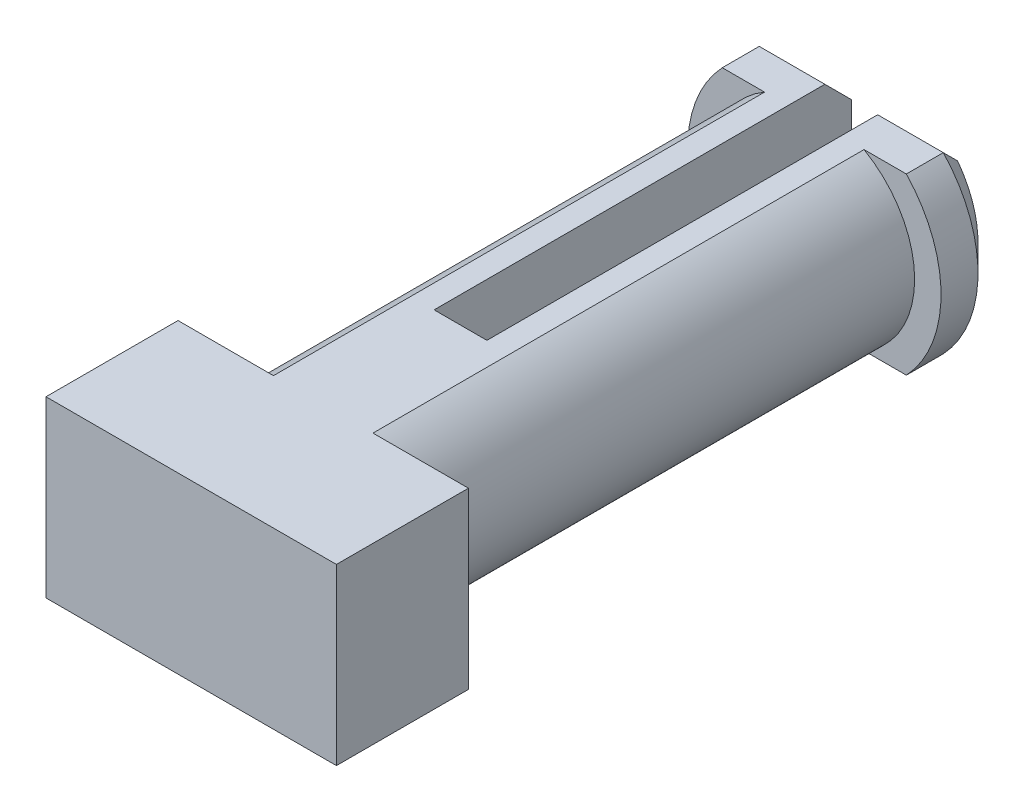
ISO-10303-21;
HEADER;
FILE_DESCRIPTION(('STEP AP214'),'2;1');
FILE_NAME('part.step','',(''),(''),'','','');
FILE_SCHEMA(('AUTOMOTIVE_DESIGN { 1 0 10303 214 1 1 1 1 }'));
ENDSEC;
DATA;
#1=APPLICATION_CONTEXT('core data for automotive mechanical design processes');
#2=APPLICATION_PROTOCOL_DEFINITION('international standard','automotive_design',2000,#1);
#3=PRODUCT_CONTEXT('',#1,'mechanical');
#4=PRODUCT('Part','Part','',(#3));
#5=PRODUCT_RELATED_PRODUCT_CATEGORY('part','',(#4));
#6=PRODUCT_DEFINITION_FORMATION('','',#4);
#7=PRODUCT_DEFINITION_CONTEXT('part definition',#1,'design');
#8=PRODUCT_DEFINITION('design','',#6,#7);
#9=PRODUCT_DEFINITION_SHAPE('','',#8);
#10=(LENGTH_UNIT() NAMED_UNIT(*) SI_UNIT(.MILLI.,.METRE.));
#11=(NAMED_UNIT(*) PLANE_ANGLE_UNIT() SI_UNIT($,.RADIAN.));
#12=(NAMED_UNIT(*) SI_UNIT($,.STERADIAN.) SOLID_ANGLE_UNIT());
#13=UNCERTAINTY_MEASURE_WITH_UNIT(LENGTH_MEASURE(1.E-05),#10,'distance_accuracy_value','');
#14=(GEOMETRIC_REPRESENTATION_CONTEXT(3) GLOBAL_UNCERTAINTY_ASSIGNED_CONTEXT((#13)) GLOBAL_UNIT_ASSIGNED_CONTEXT((#10,
#11,#12)) REPRESENTATION_CONTEXT('',''));
#15=CARTESIAN_POINT('',(0.,0.,0.));
#16=DIRECTION('',(0.,0.,1.));
#17=DIRECTION('',(1.,0.,0.));
#18=AXIS2_PLACEMENT_3D('',#15,#16,#17);
#19=CARTESIAN_POINT('',(-89.0158147450447,-3.70791019395895,-27.7202949187699));
#20=DIRECTION('',(0.,0.,-1.));
#21=DIRECTION('',(-1.,0.,0.));
#22=AXIS2_PLACEMENT_3D('',#19,#20,#21);
#23=PLANE('',#22);
#24=CARTESIAN_POINT('',(-90.438910609906,-3.11791019395905,-27.7202949187699));
#25=CARTESIAN_POINT('',(-90.4065601735568,-3.07536318670952,-27.7202949187699));
#26=CARTESIAN_POINT('',(-90.3760211215179,-3.0314710673727,-27.7202949187699));
#27=CARTESIAN_POINT('',(-90.3187476375665,-2.94127401977733,-27.7202949187699));
#28=CARTESIAN_POINT('',(-90.2920130268858,-2.89496920502961,-27.7202949187699));
#29=CARTESIAN_POINT('',(-90.2178530252539,-2.75297719921772,-27.7202949187699));
#30=CARTESIAN_POINT('',(-90.1763806126109,-2.6540927187391,-27.7202949187699));
#31=CARTESIAN_POINT('',(-90.1106313066504,-2.45077436940703,-27.7202949187699));
#32=CARTESIAN_POINT('',(-90.0863614932538,-2.34633823469503,-27.7202949187699));
#33=CARTESIAN_POINT('',(-90.055700958358,-2.13489072640907,-27.7202949187699));
#34=CARTESIAN_POINT('',(-90.0493048958596,-2.02788013177257,-27.7202949187699));
#35=CARTESIAN_POINT('',(-90.0545669116182,-1.81430119919384,-27.7202949187699));
#36=CARTESIAN_POINT('',(-90.0662267159735,-1.70773290451099,-27.7202949187699));
#37=CARTESIAN_POINT('',(-90.1072783854181,-1.49803829960176,-27.7202949187699));
#38=CARTESIAN_POINT('',(-90.1366721605068,-1.39491236138978,-27.7202949187699));
#39=CARTESIAN_POINT('',(-90.2068300935076,-1.20965794405778,-27.7202949187699));
#40=CARTESIAN_POINT('',(-90.2453165657773,-1.12665799876657,-27.7202949187699));
#41=CARTESIAN_POINT('',(-90.3337397896723,-0.967078297180336,-27.7202949187699));
#42=CARTESIAN_POINT('',(-90.3836684343451,-0.890494047480662,-27.7202949187699));
#43=CARTESIAN_POINT('',(-90.4389106099059,-0.817910193959025,-27.7202949187699));
#44=B_SPLINE_CURVE_WITH_KNOTS('',3,(#24,#25,#26,#27,#28,#29,#30,#31,#32,#33,#34,#35,#36,#37,#38,
#39,#40,#41,#42,#43),.UNSPECIFIED.,.F.,.F.,(4,2,2,2,2,2,2,2,2,4),(0.,0.160248576795779,
0.320489621120865,0.640526560583388,0.9606951384478,1.28076803393229,1.60087152951926,
1.92100950732562,2.19455099917796,2.46789927867116),.UNSPECIFIED.);
#45=CARTESIAN_POINT('',(-90.4389106099061,-3.117910193959,-27.7202949187699));
#46=VERTEX_POINT('',#45);
#47=CARTESIAN_POINT('',(-90.438910609906,-0.817910193958972,-27.7202949187699));
#48=VERTEX_POINT('',#47);
#49=EDGE_CURVE('E19',#46,#48,#44,.T.);
#50=ORIENTED_EDGE('',*,*,#49,.F.);
#51=DIRECTION('',(1.,0.,0.));
#52=VECTOR('',#51,1.);
#53=CARTESIAN_POINT('',(-91.9356432067108,-3.11791019395896,-27.7202949187699));
#54=LINE('',#53,#52);
#55=CARTESIAN_POINT('',(-91.4513589561315,-3.11791019395896,-27.7202949187699));
#56=VERTEX_POINT('',#55);
#57=EDGE_CURVE('E348',#56,#46,#54,.T.);
#58=ORIENTED_EDGE('',*,*,#57,.F.);
#59=DIRECTION('',(0.,1.,0.));
#60=VECTOR('',#59,1.);
#61=CARTESIAN_POINT('',(-91.4513589561315,0.372089806041032,-27.7202949187699));
#62=LINE('',#61,#60);
#63=CARTESIAN_POINT('',(-91.4513589561315,-0.817910193958939,-27.7202949187699));
#64=VERTEX_POINT('',#63);
#65=EDGE_CURVE('E119',#64,#56,#62,.F.);
#66=ORIENTED_EDGE('',*,*,#65,.F.);
#67=DIRECTION('',(1.,0.,0.));
#68=VECTOR('',#67,1.);
#69=CARTESIAN_POINT('',(-89.7242321997589,-0.817910193958919,-27.7202949187699));
#70=LINE('',#69,#68);
#71=EDGE_CURVE('E147',#48,#64,#70,.F.);
#72=ORIENTED_EDGE('',*,*,#71,.F.);
#73=EDGE_LOOP('',(#50,#58,#66,#72));
#74=FACE_BOUND('',#73,.T.);
#75=ADVANCED_FACE('F15',(#74),#23,.T.);
#76=CARTESIAN_POINT('',(-91.9513589561315,-1.96791019395895,-29.62029491877));
#77=CARTESIAN_POINT('',(-91.9513589561315,-4.60911019395898,-26.97909491877));
#78=CARTESIAN_POINT('',(-91.9513589561315,-1.96791019395895,-29.62029491877));
#79=CARTESIAN_POINT('',(-89.3101589561315,-4.60911019395898,-26.97909491877));
#80=CARTESIAN_POINT('',(-91.9513589561315,-1.96791019395895,-29.62029491877));
#81=CARTESIAN_POINT('',(-89.3101589561315,-1.96791019395895,-26.97909491877));
#82=CARTESIAN_POINT('',(-91.9513589561315,-1.96791019395895,-29.62029491877));
#83=CARTESIAN_POINT('',(-89.3101589561315,0.673289806041071,-26.97909491877));
#84=CARTESIAN_POINT('',(-91.9513589561315,-1.96791019395895,-29.62029491877));
#85=CARTESIAN_POINT('',(-91.9513589561315,0.673289806041072,-26.97909491877));
#86=CARTESIAN_POINT('',(-91.9513589561315,-1.96791019395895,-29.62029491877));
#87=CARTESIAN_POINT('',(-94.5925589561315,0.673289806041072,-26.97909491877));
#88=CARTESIAN_POINT('',(-91.9513589561315,-1.96791019395895,-29.62029491877));
#89=CARTESIAN_POINT('',(-94.5925589561315,-1.96791019395895,-26.97909491877));
#90=CARTESIAN_POINT('',(-91.9513589561315,-1.96791019395895,-29.62029491877));
#91=CARTESIAN_POINT('',(-94.5925589561315,-4.60911019395898,-26.97909491877));
#92=CARTESIAN_POINT('',(-91.9513589561315,-1.96791019395895,-29.62029491877));
#93=CARTESIAN_POINT('',(-91.9513589561315,-4.60911019395898,-26.97909491877));
#94=(BOUNDED_SURFACE() B_SPLINE_SURFACE(2,1,((#76,#77),(#78,#79),(#80,#81),(#82,#83),(#84,#85),
(#86,#87),(#88,#89),(#90,#91),(#92,#93)),.UNSPECIFIED.,.T.,.F.,
.F.) B_SPLINE_SURFACE_WITH_KNOTS((3,2,2,2,3),(2,2),(0.,1.5707963267949,3.14159265358979,
4.71238898038469,6.28318530717959),(0.,3.73522086093982),
.UNSPECIFIED.) GEOMETRIC_REPRESENTATION_ITEM() RATIONAL_B_SPLINE_SURFACE(((1.,1.),
(0.707106781186548,0.707106781186548),(1.,1.),(0.707106781186548,0.707106781186548),(1.,1.),
(0.707106781186548,0.707106781186548),(1.,1.),(0.707106781186548,0.707106781186548),(1.,1.))) REPRESENTATION_ITEM('') SURFACE());
#95=CARTESIAN_POINT('',(-90.4389106099061,-3.11791019395897,-27.7202949187699));
#96=CARTESIAN_POINT('',(-90.3237135301226,-3.35021637103673,-27.4879887416921));
#97=CARTESIAN_POINT('',(-90.2085164503382,-3.61791019395897,-27.2202949187699));
#98=B_SPLINE_CURVE_WITH_KNOTS('',2,(#95,#96,#97),.UNSPECIFIED.,.F.,.F.,(3,3),(0.,1.),.UNSPECIFIED.);
#99=CARTESIAN_POINT('',(-90.2085164503382,-3.61791019395895,-27.2202949187699));
#100=VERTEX_POINT('',#99);
#101=EDGE_CURVE('E143',#46,#100,#98,.T.);
#102=CARTESIAN_POINT('',(-90.2085164503382,-0.317910193958924,-27.2202949187699));
#103=CARTESIAN_POINT('',(-90.3237135301225,-0.58560401688109,-27.4879887416921));
#104=CARTESIAN_POINT('',(-90.4389106099061,-0.817910193958919,-27.7202949187699));
#105=B_SPLINE_CURVE_WITH_KNOTS('',2,(#102,#103,#104),.UNSPECIFIED.,.F.,.F.,(3,3),(0.,1.),.UNSPECIFIED.);
#106=CARTESIAN_POINT('',(-90.2085164503382,-0.31791019395895,-27.2202949187699));
#107=VERTEX_POINT('',#106);
#108=EDGE_CURVE('E140',#107,#48,#105,.T.);
#109=CARTESIAN_POINT('',(-91.9513589561315,-1.96791019395895,-27.2202949187699));
#110=DIRECTION('',(0.,0.,1.));
#111=DIRECTION('',(0.,-1.,0.));
#112=AXIS2_PLACEMENT_3D('',#109,#110,#111);
#113=CIRCLE('',#112,2.39999999999999);
#114=EDGE_CURVE('E229',#100,#107,#113,.T.);
#115=ORIENTED_EDGE('',*,*,#101,.F.);
#116=ORIENTED_EDGE('',*,*,#49,.T.);
#117=ORIENTED_EDGE('',*,*,#108,.F.);
#118=ORIENTED_EDGE('',*,*,#114,.F.);
#119=EDGE_LOOP('',(#115,#116,#117,#118));
#120=FACE_BOUND('',#119,.T.);
#121=ADVANCED_FACE('F138',(#120),#94,.T.);
#122=CARTESIAN_POINT('',(-91.9513589561315,-1.96791019395895,-29.62029491877));
#123=CARTESIAN_POINT('',(-91.9513589561315,-4.60911019395898,-26.97909491877));
#124=CARTESIAN_POINT('',(-91.9513589561315,-1.96791019395895,-29.62029491877));
#125=CARTESIAN_POINT('',(-89.3101589561315,-4.60911019395898,-26.97909491877));
#126=CARTESIAN_POINT('',(-91.9513589561315,-1.96791019395895,-29.62029491877));
#127=CARTESIAN_POINT('',(-89.3101589561315,-1.96791019395895,-26.97909491877));
#128=CARTESIAN_POINT('',(-91.9513589561315,-1.96791019395895,-29.62029491877));
#129=CARTESIAN_POINT('',(-89.3101589561315,0.673289806041071,-26.97909491877));
#130=CARTESIAN_POINT('',(-91.9513589561315,-1.96791019395895,-29.62029491877));
#131=CARTESIAN_POINT('',(-91.9513589561315,0.673289806041072,-26.97909491877));
#132=CARTESIAN_POINT('',(-91.9513589561315,-1.96791019395895,-29.62029491877));
#133=CARTESIAN_POINT('',(-94.5925589561315,0.673289806041072,-26.97909491877));
#134=CARTESIAN_POINT('',(-91.9513589561315,-1.96791019395895,-29.62029491877));
#135=CARTESIAN_POINT('',(-94.5925589561315,-1.96791019395895,-26.97909491877));
#136=CARTESIAN_POINT('',(-91.9513589561315,-1.96791019395895,-29.62029491877));
#137=CARTESIAN_POINT('',(-94.5925589561315,-4.60911019395898,-26.97909491877));
#138=CARTESIAN_POINT('',(-91.9513589561315,-1.96791019395895,-29.62029491877));
#139=CARTESIAN_POINT('',(-91.9513589561315,-4.60911019395898,-26.97909491877));
#140=(BOUNDED_SURFACE() B_SPLINE_SURFACE(2,1,((#122,#123),(#124,#125),(#126,#127),(#128,#129),
(#130,#131),(#132,#133),(#134,#135),(#136,#137),(#138,#139)),.UNSPECIFIED.,.T.,.F.,
.F.) B_SPLINE_SURFACE_WITH_KNOTS((3,2,2,2,3),(2,2),(0.,1.5707963267949,3.14159265358979,
4.71238898038469,6.28318530717959),(0.,3.73522086093982),
.UNSPECIFIED.) GEOMETRIC_REPRESENTATION_ITEM() RATIONAL_B_SPLINE_SURFACE(((1.,1.),
(0.707106781186548,0.707106781186548),(1.,1.),(0.707106781186548,0.707106781186548),(1.,1.),
(0.707106781186548,0.707106781186548),(1.,1.),(0.707106781186548,0.707106781186548),(1.,1.))) REPRESENTATION_ITEM('') SURFACE());
#141=CARTESIAN_POINT('',(-93.4638073023569,-0.817910193958918,-27.7202949187699));
#142=CARTESIAN_POINT('',(-93.57900438214,-0.585604016881727,-27.4879887416927));
#143=CARTESIAN_POINT('',(-93.6942014619248,-0.317910193958924,-27.2202949187699));
#144=B_SPLINE_CURVE_WITH_KNOTS('',2,(#141,#142,#143),.UNSPECIFIED.,.F.,.F.,(3,3),(0.,1.),.UNSPECIFIED.);
#145=CARTESIAN_POINT('',(-93.463807302357,-0.817910193958977,-27.7202949187699));
#146=VERTEX_POINT('',#145);
#147=CARTESIAN_POINT('',(-93.6942014619248,-0.317910193958931,-27.2202949187699));
#148=VERTEX_POINT('',#147);
#149=EDGE_CURVE('E157',#146,#148,#144,.T.);
#150=CARTESIAN_POINT('',(-93.463807302357,-3.11791019395903,-27.7202949187699));
#151=CARTESIAN_POINT('',(-93.4961577387062,-3.07536318670949,-27.7202949187699));
#152=CARTESIAN_POINT('',(-93.5266967907451,-3.03147106737268,-27.7202949187699));
#153=CARTESIAN_POINT('',(-93.5839702746965,-2.94127401977731,-27.7202949187699));
#154=CARTESIAN_POINT('',(-93.6107048853773,-2.89496920502961,-27.7202949187699));
#155=CARTESIAN_POINT('',(-93.6848648870091,-2.75297719921772,-27.7202949187699));
#156=CARTESIAN_POINT('',(-93.7263372996521,-2.65409271873909,-27.7202949187699));
#157=CARTESIAN_POINT('',(-93.7920866056126,-2.45077436940702,-27.7202949187699));
#158=CARTESIAN_POINT('',(-93.8163564190092,-2.34633823469503,-27.7202949187699));
#159=CARTESIAN_POINT('',(-93.8470169539051,-2.13489072640908,-27.7202949187699));
#160=CARTESIAN_POINT('',(-93.8534130164035,-2.02788013177258,-27.7202949187699));
#161=CARTESIAN_POINT('',(-93.8481510006448,-1.81430119919385,-27.7202949187699));
#162=CARTESIAN_POINT('',(-93.8364911962895,-1.707732904511,-27.7202949187699));
#163=CARTESIAN_POINT('',(-93.7954395268449,-1.49803829960176,-27.7202949187699));
#164=CARTESIAN_POINT('',(-93.7660457517562,-1.39491236138978,-27.7202949187699));
#165=CARTESIAN_POINT('',(-93.6958878187554,-1.20965794405778,-27.7202949187699));
#166=CARTESIAN_POINT('',(-93.6574013464857,-1.12665799876657,-27.7202949187699));
#167=CARTESIAN_POINT('',(-93.5689781225907,-0.967078297180347,-27.7202949187699));
#168=CARTESIAN_POINT('',(-93.5190494779179,-0.890494047480676,-27.7202949187699));
#169=CARTESIAN_POINT('',(-93.4638073023571,-0.817910193959037,-27.7202949187699));
#170=B_SPLINE_CURVE_WITH_KNOTS('',3,(#150,#151,#152,#153,#154,#155,#156,#157,#158,#159,#160,
#161,#162,#163,#164,#165,#166,#167,#168,#169),.UNSPECIFIED.,.F.,.F.,(4,2,2,2,2,2,2,2,2,4),(0.,
0.160248576795774,0.320489621120852,0.640526560583375,0.960695138447777,1.28076803393225,
1.60087152951924,1.9210095073256,2.19455099917794,2.46789927867114),.UNSPECIFIED.);
#171=CARTESIAN_POINT('',(-93.4638073023569,-3.117910193959,-27.7202949187699));
#172=VERTEX_POINT('',#171);
#173=EDGE_CURVE('E145',#172,#146,#170,.T.);
#174=CARTESIAN_POINT('',(-93.6942014619248,-3.61791019395897,-27.2202949187699));
#175=CARTESIAN_POINT('',(-93.57900438214,-3.35021637103614,-27.4879887416927));
#176=CARTESIAN_POINT('',(-93.4638073023569,-3.11791019395897,-27.7202949187699));
#177=B_SPLINE_CURVE_WITH_KNOTS('',2,(#174,#175,#176),.UNSPECIFIED.,.F.,.F.,(3,3),(0.,1.),.UNSPECIFIED.);
#178=CARTESIAN_POINT('',(-93.6942014619248,-3.61791019395895,-27.2202949187699));
#179=VERTEX_POINT('',#178);
#180=EDGE_CURVE('E310',#179,#172,#177,.T.);
#181=CARTESIAN_POINT('',(-91.9513589561315,-1.96791019395895,-27.2202949187699));
#182=DIRECTION('',(0.,0.,1.));
#183=DIRECTION('',(0.,-1.,0.));
#184=AXIS2_PLACEMENT_3D('',#181,#182,#183);
#185=CIRCLE('',#184,2.39999999999999);
#186=EDGE_CURVE('E449',#148,#179,#185,.T.);
#187=ORIENTED_EDGE('',*,*,#149,.F.);
#188=ORIENTED_EDGE('',*,*,#173,.F.);
#189=ORIENTED_EDGE('',*,*,#180,.F.);
#190=ORIENTED_EDGE('',*,*,#186,.F.);
#191=EDGE_LOOP('',(#187,#188,#189,#190));
#192=FACE_BOUND('',#191,.T.);
#193=ADVANCED_FACE('F233',(#192),#140,.T.);
#194=CARTESIAN_POINT('',(-91.90267311876,-3.70791019395896,-27.7202949187699));
#195=DIRECTION('',(0.,0.,-1.));
#196=DIRECTION('',(-1.,0.,0.));
#197=AXIS2_PLACEMENT_3D('',#194,#195,#196);
#198=PLANE('',#197);
#199=ORIENTED_EDGE('',*,*,#173,.T.);
#200=DIRECTION('',(1.,0.,0.));
#201=VECTOR('',#200,1.);
#202=CARTESIAN_POINT('',(-91.9670747055522,-0.817910193958929,-27.7202949187699));
#203=LINE('',#202,#201);
#204=CARTESIAN_POINT('',(-92.4513589561315,-0.817910193958941,-27.7202949187699));
#205=VERTEX_POINT('',#204);
#206=EDGE_CURVE('E135',#205,#146,#203,.F.);
#207=ORIENTED_EDGE('',*,*,#206,.F.);
#208=DIRECTION('',(0.,1.,0.));
#209=VECTOR('',#208,1.);
#210=CARTESIAN_POINT('',(-92.4513589561315,-4.30791019395894,-27.7202949187699));
#211=LINE('',#210,#209);
#212=CARTESIAN_POINT('',(-92.4513589561315,-3.11791019395897,-27.7202949187699));
#213=VERTEX_POINT('',#212);
#214=EDGE_CURVE('E150',#213,#205,#211,.T.);
#215=ORIENTED_EDGE('',*,*,#214,.F.);
#216=DIRECTION('',(1.,0.,0.));
#217=VECTOR('',#216,1.);
#218=CARTESIAN_POINT('',(-94.1784857125041,-3.11791019395897,-27.7202949187699));
#219=LINE('',#218,#217);
#220=EDGE_CURVE('E314',#172,#213,#219,.T.);
#221=ORIENTED_EDGE('',*,*,#220,.F.);
#222=EDGE_LOOP('',(#199,#207,#215,#221));
#223=FACE_BOUND('',#222,.T.);
#224=ADVANCED_FACE('F182',(#223),#198,.T.);
#225=CARTESIAN_POINT('',(-91.9670747055522,0.0920898060410904,-26.8102949187699));
#226=DIRECTION('',(0.,0.707106781186548,-0.707106781186548));
#227=DIRECTION('',(0.,0.707106781186548,0.707106781186548));
#228=AXIS2_PLACEMENT_3D('',#225,#226,#227);
#229=PLANE('',#228);
#230=ORIENTED_EDGE('',*,*,#149,.T.);
#231=DIRECTION('',(1.,0.,0.));
#232=VECTOR('',#231,1.);
#233=CARTESIAN_POINT('',(-95.6113589561315,-0.317910193958976,-27.2202949187699));
#234=LINE('',#233,#232);
#235=CARTESIAN_POINT('',(-92.4513589561315,-0.317910193958968,-27.2202949187699));
#236=VERTEX_POINT('',#235);
#237=EDGE_CURVE('E189',#236,#148,#234,.F.);
#238=ORIENTED_EDGE('',*,*,#237,.F.);
#239=DIRECTION('',(0.,0.707106781186545,0.70710678118655));
#240=VECTOR('',#239,1.);
#241=CARTESIAN_POINT('',(-92.4513589561315,-0.817910193958948,-27.7202949187699));
#242=LINE('',#241,#240);
#243=EDGE_CURVE('E201',#205,#236,#242,.T.);
#244=ORIENTED_EDGE('',*,*,#243,.F.);
#245=ORIENTED_EDGE('',*,*,#206,.T.);
#246=EDGE_LOOP('',(#230,#238,#244,#245));
#247=FACE_BOUND('',#246,.T.);
#248=ADVANCED_FACE('F177',(#247),#229,.T.);
#249=CARTESIAN_POINT('',(-89.7242321997589,0.0920898060410913,-26.8102949187699));
#250=DIRECTION('',(0.,0.707106781186547,-0.707106781186549));
#251=DIRECTION('',(0.,0.707106781186549,0.707106781186547));
#252=AXIS2_PLACEMENT_3D('',#249,#250,#251);
#253=PLANE('',#252);
#254=ORIENTED_EDGE('',*,*,#108,.T.);
#255=ORIENTED_EDGE('',*,*,#71,.T.);
#256=DIRECTION('',(0.,-0.707106781186545,-0.70710678118655));
#257=VECTOR('',#256,1.);
#258=CARTESIAN_POINT('',(-91.4513589561315,-0.317910193958952,-27.2202949187699));
#259=LINE('',#258,#257);
#260=CARTESIAN_POINT('',(-91.4513589561315,-0.317910193958972,-27.2202949187699));
#261=VERTEX_POINT('',#260);
#262=EDGE_CURVE('E360',#261,#64,#259,.T.);
#263=ORIENTED_EDGE('',*,*,#262,.F.);
#264=DIRECTION('',(1.,0.,0.));
#265=VECTOR('',#264,1.);
#266=CARTESIAN_POINT('',(-95.6113589561315,-0.317910193958976,-27.2202949187699));
#267=LINE('',#266,#265);
#268=EDGE_CURVE('E155',#107,#261,#267,.F.);
#269=ORIENTED_EDGE('',*,*,#268,.F.);
#270=EDGE_LOOP('',(#254,#255,#263,#269));
#271=FACE_BOUND('',#270,.T.);
#272=ADVANCED_FACE('F153',(#271),#253,.T.);
#273=CARTESIAN_POINT('',(-92.4513589561315,-4.30791019395894,-28.8702949187699));
#274=DIRECTION('',(1.,0.,0.));
#275=DIRECTION('',(0.,0.,-1.));
#276=AXIS2_PLACEMENT_3D('',#273,#274,#275);
#277=PLANE('',#276);
#278=ORIENTED_EDGE('',*,*,#214,.T.);
#279=ORIENTED_EDGE('',*,*,#243,.T.);
#280=DIRECTION('',(0.,0.,1.));
#281=VECTOR('',#280,1.);
#282=CARTESIAN_POINT('',(-92.4513589561315,-0.317910193958976,-28.8302949187699));
#283=LINE('',#282,#281);
#284=CARTESIAN_POINT('',(-92.4513589561315,-0.317910193958976,-19.8202949187698));
#285=VERTEX_POINT('',#284);
#286=EDGE_CURVE('E197',#285,#236,#283,.F.);
#287=ORIENTED_EDGE('',*,*,#286,.F.);
#288=DIRECTION('',(0.,1.,0.));
#289=VECTOR('',#288,1.);
#290=CARTESIAN_POINT('',(-92.4513589561315,-4.30791019395893,-19.8202949187698));
#291=LINE('',#290,#289);
#292=CARTESIAN_POINT('',(-92.4513589561315,-3.61791019395893,-19.8202949187698));
#293=VERTEX_POINT('',#292);
#294=EDGE_CURVE('E203',#293,#285,#291,.T.);
#295=ORIENTED_EDGE('',*,*,#294,.F.);
#296=DIRECTION('',(0.,0.,-1.));
#297=VECTOR('',#296,1.);
#298=CARTESIAN_POINT('',(-92.4513589561315,-3.61791019395893,-13.1102949187699));
#299=LINE('',#298,#297);
#300=CARTESIAN_POINT('',(-92.4513589561315,-3.61791019395894,-27.2202949187699));
#301=VERTEX_POINT('',#300);
#302=EDGE_CURVE('E222',#301,#293,#299,.F.);
#303=ORIENTED_EDGE('',*,*,#302,.F.);
#304=DIRECTION('',(0.,0.707106781186547,-0.707106781186548));
#305=VECTOR('',#304,1.);
#306=CARTESIAN_POINT('',(-92.4513589561315,-4.02791019395897,-26.8102949187699));
#307=LINE('',#306,#305);
#308=EDGE_CURVE('E315',#213,#301,#307,.F.);
#309=ORIENTED_EDGE('',*,*,#308,.F.);
#310=EDGE_LOOP('',(#278,#279,#287,#295,#303,#309));
#311=FACE_BOUND('',#310,.T.);
#312=ADVANCED_FACE('F176',(#311),#277,.T.);
#313=CARTESIAN_POINT('',(-90.9913589561315,-4.30791019395893,-19.8202949187698));
#314=DIRECTION('',(0.,0.,-1.));
#315=DIRECTION('',(-1.,0.,0.));
#316=AXIS2_PLACEMENT_3D('',#313,#314,#315);
#317=PLANE('',#316);
#318=DIRECTION('',(0.,1.,0.));
#319=VECTOR('',#318,1.);
#320=CARTESIAN_POINT('',(-91.4513589561315,0.372089806041032,-19.8202949187698));
#321=LINE('',#320,#319);
#322=CARTESIAN_POINT('',(-91.4513589561315,-3.61791019395893,-19.8202949187698));
#323=VERTEX_POINT('',#322);
#324=CARTESIAN_POINT('',(-91.4513589561315,-0.317910193958976,-19.8202949187698));
#325=VERTEX_POINT('',#324);
#326=EDGE_CURVE('E212',#323,#325,#321,.T.);
#327=ORIENTED_EDGE('',*,*,#326,.F.);
#328=DIRECTION('',(1.,0.,0.));
#329=VECTOR('',#328,1.);
#330=CARTESIAN_POINT('',(-95.6113589561315,-3.61791019395893,-19.8202949187698));
#331=LINE('',#330,#329);
#332=EDGE_CURVE('E364',#293,#323,#331,.T.);
#333=ORIENTED_EDGE('',*,*,#332,.F.);
#334=ORIENTED_EDGE('',*,*,#294,.T.);
#335=DIRECTION('',(1.,0.,0.));
#336=VECTOR('',#335,1.);
#337=CARTESIAN_POINT('',(-95.6113589561315,-0.317910193958976,-19.8202949187698));
#338=LINE('',#337,#336);
#339=EDGE_CURVE('E204',#325,#285,#338,.F.);
#340=ORIENTED_EDGE('',*,*,#339,.F.);
#341=EDGE_LOOP('',(#327,#333,#334,#340));
#342=FACE_BOUND('',#341,.T.);
#343=ADVANCED_FACE('F373',(#342),#317,.T.);
#344=CARTESIAN_POINT('',(-91.4513589561315,0.372089806041032,-28.8702949187699));
#345=DIRECTION('',(-1.,0.,0.));
#346=DIRECTION('',(0.,0.,1.));
#347=AXIS2_PLACEMENT_3D('',#344,#345,#346);
#348=PLANE('',#347);
#349=DIRECTION('',(0.,0.,1.));
#350=VECTOR('',#349,1.);
#351=CARTESIAN_POINT('',(-91.4513589561315,-0.317910193958976,-28.8302949187699));
#352=LINE('',#351,#350);
#353=EDGE_CURVE('E208',#261,#325,#352,.T.);
#354=ORIENTED_EDGE('',*,*,#353,.F.);
#355=ORIENTED_EDGE('',*,*,#262,.T.);
#356=ORIENTED_EDGE('',*,*,#65,.T.);
#357=DIRECTION('',(0.,0.707106781186547,-0.707106781186548));
#358=VECTOR('',#357,1.);
#359=CARTESIAN_POINT('',(-91.4513589561315,-4.02791019395897,-26.8102949187699));
#360=LINE('',#359,#358);
#361=CARTESIAN_POINT('',(-91.4513589561315,-3.61791019395894,-27.2202949187699));
#362=VERTEX_POINT('',#361);
#363=EDGE_CURVE('E357',#362,#56,#360,.T.);
#364=ORIENTED_EDGE('',*,*,#363,.F.);
#365=DIRECTION('',(0.,0.,-1.));
#366=VECTOR('',#365,1.);
#367=CARTESIAN_POINT('',(-91.4513589561315,-3.61791019395893,-13.1102949187699));
#368=LINE('',#367,#366);
#369=EDGE_CURVE('E361',#323,#362,#368,.T.);
#370=ORIENTED_EDGE('',*,*,#369,.F.);
#371=ORIENTED_EDGE('',*,*,#326,.T.);
#372=EDGE_LOOP('',(#354,#355,#356,#364,#370,#371));
#373=FACE_BOUND('',#372,.T.);
#374=ADVANCED_FACE('F342',(#373),#348,.T.);
#375=CARTESIAN_POINT('',(-91.9356432067108,-4.02791019395897,-26.8102949187699));
#376=DIRECTION('',(0.,-0.707106781186548,-0.707106781186547));
#377=DIRECTION('',(0.,0.707106781186547,-0.707106781186548));
#378=AXIS2_PLACEMENT_3D('',#375,#376,#377);
#379=PLANE('',#378);
#380=ORIENTED_EDGE('',*,*,#101,.T.);
#381=DIRECTION('',(1.,0.,0.));
#382=VECTOR('',#381,1.);
#383=CARTESIAN_POINT('',(-95.6113589561315,-3.61791019395893,-27.2202949187699));
#384=LINE('',#383,#382);
#385=EDGE_CURVE('E349',#362,#100,#384,.T.);
#386=ORIENTED_EDGE('',*,*,#385,.F.);
#387=ORIENTED_EDGE('',*,*,#363,.T.);
#388=ORIENTED_EDGE('',*,*,#57,.T.);
#389=EDGE_LOOP('',(#380,#386,#387,#388));
#390=FACE_BOUND('',#389,.T.);
#391=ADVANCED_FACE('F260',(#390),#379,.T.);
#392=CARTESIAN_POINT('',(-91.9513589561315,-1.96791019395895,-27.2914949187698));
#393=DIRECTION('',(0.,0.,1.));
#394=DIRECTION('',(0.,-1.,0.));
#395=AXIS2_PLACEMENT_3D('',#392,#393,#394);
#396=CYLINDRICAL_SURFACE('',#395,2.39999999999999);
#397=DIRECTION('',(0.,0.,1.));
#398=VECTOR('',#397,1.);
#399=CARTESIAN_POINT('',(-90.2085164503382,-0.317910193958976,-28.8302949187699));
#400=LINE('',#399,#398);
#401=CARTESIAN_POINT('',(-90.2085164503382,-0.317910193958976,-26.5202949187701));
#402=VERTEX_POINT('',#401);
#403=EDGE_CURVE('E382',#402,#107,#400,.F.);
#404=ORIENTED_EDGE('',*,*,#403,.F.);
#405=CARTESIAN_POINT('',(-91.9513589561315,-1.96791019395895,-26.5202949187701));
#406=DIRECTION('',(0.,0.,1.));
#407=DIRECTION('',(0.,-1.,0.));
#408=AXIS2_PLACEMENT_3D('',#405,#406,#407);
#409=CIRCLE('',#408,2.39999999999999);
#410=CARTESIAN_POINT('',(-90.2085164503382,-3.61791019395893,-26.5202949187701));
#411=VERTEX_POINT('',#410);
#412=EDGE_CURVE('E228',#411,#402,#409,.T.);
#413=ORIENTED_EDGE('',*,*,#412,.F.);
#414=DIRECTION('',(0.,0.,-1.));
#415=VECTOR('',#414,1.);
#416=CARTESIAN_POINT('',(-90.2085164503382,-3.61791019395893,-13.1102949187699));
#417=LINE('',#416,#415);
#418=EDGE_CURVE('E477',#100,#411,#417,.F.);
#419=ORIENTED_EDGE('',*,*,#418,.F.);
#420=ORIENTED_EDGE('',*,*,#114,.T.);
#421=EDGE_LOOP('',(#404,#413,#419,#420));
#422=FACE_BOUND('',#421,.T.);
#423=ADVANCED_FACE('F256',(#422),#396,.T.);
#424=CARTESIAN_POINT('',(-91.6055741325299,-4.30791019395893,-26.5202949187701));
#425=DIRECTION('',(0.,0.,1.));
#426=DIRECTION('',(1.,0.,0.));
#427=AXIS2_PLACEMENT_3D('',#424,#425,#426);
#428=PLANE('',#427);
#429=ORIENTED_EDGE('',*,*,#412,.T.);
#430=DIRECTION('',(1.,0.,0.));
#431=VECTOR('',#430,1.);
#432=CARTESIAN_POINT('',(-95.6113589561315,-0.317910193958976,-26.5202949187701));
#433=LINE('',#432,#431);
#434=CARTESIAN_POINT('',(-91.0092867720606,-0.317910193958976,-26.5202949187701));
#435=VERTEX_POINT('',#434);
#436=EDGE_CURVE('E386',#435,#402,#433,.T.);
#437=ORIENTED_EDGE('',*,*,#436,.F.);
#438=CARTESIAN_POINT('',(-91.9513589561315,-1.96791019395895,-26.5202949187701));
#439=DIRECTION('',(0.,0.,1.));
#440=DIRECTION('',(1.,0.,0.));
#441=AXIS2_PLACEMENT_3D('',#438,#439,#440);
#442=CIRCLE('',#441,1.9);
#443=CARTESIAN_POINT('',(-91.0092867720606,-3.61791019395893,-26.5202949187701));
#444=VERTEX_POINT('',#443);
#445=EDGE_CURVE('E226',#444,#435,#442,.T.);
#446=ORIENTED_EDGE('',*,*,#445,.F.);
#447=DIRECTION('',(1.,0.,0.));
#448=VECTOR('',#447,1.);
#449=CARTESIAN_POINT('',(-95.6113589561315,-3.61791019395893,-26.5202949187701));
#450=LINE('',#449,#448);
#451=EDGE_CURVE('E474',#411,#444,#450,.F.);
#452=ORIENTED_EDGE('',*,*,#451,.F.);
#453=EDGE_LOOP('',(#429,#437,#446,#452));
#454=FACE_BOUND('',#453,.T.);
#455=ADVANCED_FACE('F259',(#454),#428,.T.);
#456=CARTESIAN_POINT('',(-91.9513589561315,-1.96791019395895,-27.4514949187701));
#457=DIRECTION('',(0.,0.,1.));
#458=DIRECTION('',(1.,0.,0.));
#459=AXIS2_PLACEMENT_3D('',#456,#457,#458);
#460=CYLINDRICAL_SURFACE('',#459,1.9);
#461=ORIENTED_EDGE('',*,*,#445,.T.);
#462=DIRECTION('',(0.,0.,1.));
#463=VECTOR('',#462,1.);
#464=CARTESIAN_POINT('',(-91.0092867720606,-0.317910193958976,-28.8302949187699));
#465=LINE('',#464,#463);
#466=CARTESIAN_POINT('',(-91.0092867720606,-0.317910193958976,-17.2202949187699));
#467=VERTEX_POINT('',#466);
#468=EDGE_CURVE('E389',#467,#435,#465,.F.);
#469=ORIENTED_EDGE('',*,*,#468,.F.);
#470=CARTESIAN_POINT('',(-91.9513589561315,-1.96791019395895,-17.2202949187699));
#471=DIRECTION('',(0.,0.,1.));
#472=DIRECTION('',(1.,0.,0.));
#473=AXIS2_PLACEMENT_3D('',#470,#471,#472);
#474=CIRCLE('',#473,1.9);
#475=CARTESIAN_POINT('',(-91.0092867720606,-3.61791019395893,-17.2202949187699));
#476=VERTEX_POINT('',#475);
#477=EDGE_CURVE('E223',#476,#467,#474,.T.);
#478=ORIENTED_EDGE('',*,*,#477,.F.);
#479=DIRECTION('',(0.,0.,-1.));
#480=VECTOR('',#479,1.);
#481=CARTESIAN_POINT('',(-91.0092867720606,-3.61791019395893,-13.1102949187699));
#482=LINE('',#481,#480);
#483=EDGE_CURVE('E471',#444,#476,#482,.F.);
#484=ORIENTED_EDGE('',*,*,#483,.F.);
#485=EDGE_LOOP('',(#461,#469,#478,#484));
#486=FACE_BOUND('',#485,.T.);
#487=ADVANCED_FACE('F262',(#486),#460,.T.);
#488=CARTESIAN_POINT('',(-88.6605661745386,-4.30791019395893,-17.2202949187699));
#489=DIRECTION('',(0.,0.,-1.));
#490=DIRECTION('',(-1.,0.,0.));
#491=AXIS2_PLACEMENT_3D('',#488,#489,#490);
#492=PLANE('',#491);
#493=DIRECTION('',(1.,0.,0.));
#494=VECTOR('',#493,1.);
#495=CARTESIAN_POINT('',(-95.6113589561315,-3.61791019395893,-17.2202949187699));
#496=LINE('',#495,#494);
#497=CARTESIAN_POINT('',(-89.2013589561315,-3.61791019395893,-17.2202949187699));
#498=VERTEX_POINT('',#497);
#499=EDGE_CURVE('E467',#476,#498,#496,.T.);
#500=ORIENTED_EDGE('',*,*,#499,.F.);
#501=ORIENTED_EDGE('',*,*,#477,.T.);
#502=DIRECTION('',(1.,0.,0.));
#503=VECTOR('',#502,1.);
#504=CARTESIAN_POINT('',(-95.6113589561315,-0.317910193958976,-17.2202949187699));
#505=LINE('',#504,#503);
#506=CARTESIAN_POINT('',(-89.2013589561315,-0.317910193958976,-17.2202949187699));
#507=VERTEX_POINT('',#506);
#508=EDGE_CURVE('E392',#507,#467,#505,.F.);
#509=ORIENTED_EDGE('',*,*,#508,.F.);
#510=DIRECTION('',(0.,1.,0.));
#511=VECTOR('',#510,1.);
#512=CARTESIAN_POINT('',(-89.2013589561315,-4.30791019395893,-17.2202949187699));
#513=LINE('',#512,#511);
#514=EDGE_CURVE('E225',#498,#507,#513,.T.);
#515=ORIENTED_EDGE('',*,*,#514,.F.);
#516=EDGE_LOOP('',(#500,#501,#509,#515));
#517=FACE_BOUND('',#516,.T.);
#518=ADVANCED_FACE('F264',(#517),#492,.T.);
#519=CARTESIAN_POINT('',(-89.2013589561315,-4.30791019395893,-17.8302949187699));
#520=DIRECTION('',(1.,0.,0.));
#521=DIRECTION('',(0.,0.,-1.));
#522=AXIS2_PLACEMENT_3D('',#519,#520,#521);
#523=PLANE('',#522);
#524=DIRECTION('',(0.,0.,1.));
#525=VECTOR('',#524,1.);
#526=CARTESIAN_POINT('',(-89.2013589561315,-0.317910193958976,-28.8302949187699));
#527=LINE('',#526,#525);
#528=CARTESIAN_POINT('',(-89.2013589561315,-0.317910193958976,-14.7202949187699));
#529=VERTEX_POINT('',#528);
#530=EDGE_CURVE('E395',#529,#507,#527,.F.);
#531=ORIENTED_EDGE('',*,*,#530,.F.);
#532=DIRECTION('',(0.,1.,0.));
#533=VECTOR('',#532,1.);
#534=CARTESIAN_POINT('',(-89.2013589561315,-4.30791019395893,-14.7202949187699));
#535=LINE('',#534,#533);
#536=CARTESIAN_POINT('',(-89.2013589561315,-3.61791019395893,-14.7202949187699));
#537=VERTEX_POINT('',#536);
#538=EDGE_CURVE('E453',#537,#529,#535,.T.);
#539=ORIENTED_EDGE('',*,*,#538,.F.);
#540=DIRECTION('',(0.,0.,-1.));
#541=VECTOR('',#540,1.);
#542=CARTESIAN_POINT('',(-89.2013589561315,-3.61791019395893,-13.1102949187699));
#543=LINE('',#542,#541);
#544=EDGE_CURVE('E463',#498,#537,#543,.F.);
#545=ORIENTED_EDGE('',*,*,#544,.F.);
#546=ORIENTED_EDGE('',*,*,#514,.T.);
#547=EDGE_LOOP('',(#531,#539,#545,#546));
#548=FACE_BOUND('',#547,.T.);
#549=ADVANCED_FACE('F328',(#548),#523,.T.);
#550=CARTESIAN_POINT('',(-95.6113589561315,-4.30791019395893,-14.7202949187699));
#551=DIRECTION('',(0.,0.,1.));
#552=DIRECTION('',(1.,0.,0.));
#553=AXIS2_PLACEMENT_3D('',#550,#551,#552);
#554=PLANE('',#553);
#555=DIRECTION('',(0.,1.,0.));
#556=VECTOR('',#555,1.);
#557=CARTESIAN_POINT('',(-94.7013589561315,0.372089806041018,-14.7202949187699));
#558=LINE('',#557,#556);
#559=CARTESIAN_POINT('',(-94.7013589561315,-3.61791019395893,-14.7202949187699));
#560=VERTEX_POINT('',#559);
#561=CARTESIAN_POINT('',(-94.7013589561315,-0.317910193958976,-14.7202949187699));
#562=VERTEX_POINT('',#561);
#563=EDGE_CURVE('E412',#560,#562,#558,.T.);
#564=ORIENTED_EDGE('',*,*,#563,.F.);
#565=DIRECTION('',(1.,0.,0.));
#566=VECTOR('',#565,1.);
#567=CARTESIAN_POINT('',(-95.6113589561315,-3.61791019395893,-14.7202949187699));
#568=LINE('',#567,#566);
#569=EDGE_CURVE('E459',#537,#560,#568,.F.);
#570=ORIENTED_EDGE('',*,*,#569,.F.);
#571=ORIENTED_EDGE('',*,*,#538,.T.);
#572=DIRECTION('',(1.,0.,0.));
#573=VECTOR('',#572,1.);
#574=CARTESIAN_POINT('',(-95.6113589561315,-0.317910193958976,-14.7202949187699));
#575=LINE('',#574,#573);
#576=EDGE_CURVE('E398',#562,#529,#575,.T.);
#577=ORIENTED_EDGE('',*,*,#576,.F.);
#578=EDGE_LOOP('',(#564,#570,#571,#577));
#579=FACE_BOUND('',#578,.T.);
#580=ADVANCED_FACE('F279',(#579),#554,.T.);
#581=CARTESIAN_POINT('',(-94.7013589561315,0.372089806041018,-17.8302949187699));
#582=DIRECTION('',(-1.,0.,0.));
#583=DIRECTION('',(0.,0.,1.));
#584=AXIS2_PLACEMENT_3D('',#581,#582,#583);
#585=PLANE('',#584);
#586=DIRECTION('',(0.,0.,-1.));
#587=VECTOR('',#586,1.);
#588=CARTESIAN_POINT('',(-94.7013589561315,-3.61791019395893,-13.1102949187699));
#589=LINE('',#588,#587);
#590=CARTESIAN_POINT('',(-94.7013589561315,-3.61791019395893,-17.2202949187699));
#591=VERTEX_POINT('',#590);
#592=EDGE_CURVE('E309',#560,#591,#589,.T.);
#593=ORIENTED_EDGE('',*,*,#592,.F.);
#594=ORIENTED_EDGE('',*,*,#563,.T.);
#595=DIRECTION('',(0.,0.,1.));
#596=VECTOR('',#595,1.);
#597=CARTESIAN_POINT('',(-94.7013589561315,-0.317910193958976,-28.8302949187699));
#598=LINE('',#597,#596);
#599=CARTESIAN_POINT('',(-94.7013589561315,-0.317910193958976,-17.2202949187699));
#600=VERTEX_POINT('',#599);
#601=EDGE_CURVE('E306',#600,#562,#598,.T.);
#602=ORIENTED_EDGE('',*,*,#601,.F.);
#603=DIRECTION('',(0.,1.,0.));
#604=VECTOR('',#603,1.);
#605=CARTESIAN_POINT('',(-94.7013589561315,-4.30791019395894,-17.2202949187699));
#606=LINE('',#605,#604);
#607=EDGE_CURVE('E200',#591,#600,#606,.T.);
#608=ORIENTED_EDGE('',*,*,#607,.F.);
#609=EDGE_LOOP('',(#593,#594,#602,#608));
#610=FACE_BOUND('',#609,.T.);
#611=ADVANCED_FACE('F269',(#610),#585,.T.);
#612=CARTESIAN_POINT('',(-91.9513589561315,-1.96791019395895,-27.2914949187698));
#613=DIRECTION('',(0.,0.,1.));
#614=DIRECTION('',(0.,-1.,0.));
#615=AXIS2_PLACEMENT_3D('',#612,#613,#614);
#616=CYLINDRICAL_SURFACE('',#615,2.39999999999999);
#617=DIRECTION('',(0.,0.,-1.));
#618=VECTOR('',#617,1.);
#619=CARTESIAN_POINT('',(-93.6942014619248,-3.61791019395893,-13.1102949187699));
#620=LINE('',#619,#618);
#621=CARTESIAN_POINT('',(-93.6942014619248,-3.61791019395893,-26.5202949187701));
#622=VERTEX_POINT('',#621);
#623=EDGE_CURVE('E301',#622,#179,#620,.T.);
#624=ORIENTED_EDGE('',*,*,#623,.F.);
#625=CARTESIAN_POINT('',(-91.9513589561315,-1.96791019395895,-26.5202949187701));
#626=DIRECTION('',(0.,0.,1.));
#627=DIRECTION('',(0.,-1.,0.));
#628=AXIS2_PLACEMENT_3D('',#625,#626,#627);
#629=CIRCLE('',#628,2.39999999999999);
#630=CARTESIAN_POINT('',(-93.6942014619248,-0.317910193958972,-26.5202949187701));
#631=VERTEX_POINT('',#630);
#632=EDGE_CURVE('E220',#631,#622,#629,.T.);
#633=ORIENTED_EDGE('',*,*,#632,.F.);
#634=DIRECTION('',(0.,0.,1.));
#635=VECTOR('',#634,1.);
#636=CARTESIAN_POINT('',(-93.6942014619248,-0.317910193958976,-28.8302949187699));
#637=LINE('',#636,#635);
#638=EDGE_CURVE('E164',#148,#631,#637,.T.);
#639=ORIENTED_EDGE('',*,*,#638,.F.);
#640=ORIENTED_EDGE('',*,*,#186,.T.);
#641=EDGE_LOOP('',(#624,#633,#639,#640));
#642=FACE_BOUND('',#641,.T.);
#643=ADVANCED_FACE('F266',(#642),#616,.T.);
#644=CARTESIAN_POINT('',(-94.1784857125041,-4.02791019395897,-26.8102949187699));
#645=DIRECTION('',(0.,-0.707106781186548,-0.707106781186547));
#646=DIRECTION('',(0.,0.707106781186547,-0.707106781186548));
#647=AXIS2_PLACEMENT_3D('',#644,#645,#646);
#648=PLANE('',#647);
#649=ORIENTED_EDGE('',*,*,#180,.T.);
#650=ORIENTED_EDGE('',*,*,#220,.T.);
#651=ORIENTED_EDGE('',*,*,#308,.T.);
#652=DIRECTION('',(1.,0.,0.));
#653=VECTOR('',#652,1.);
#654=CARTESIAN_POINT('',(-95.6113589561315,-3.61791019395893,-27.2202949187699));
#655=LINE('',#654,#653);
#656=EDGE_CURVE('E219',#179,#301,#655,.T.);
#657=ORIENTED_EDGE('',*,*,#656,.F.);
#658=EDGE_LOOP('',(#649,#650,#651,#657));
#659=FACE_BOUND('',#658,.T.);
#660=ADVANCED_FACE('F268',(#659),#648,.T.);
#661=CARTESIAN_POINT('',(-92.3526383586094,-4.30791019395894,-17.2202949187699));
#662=DIRECTION('',(0.,0.,-1.));
#663=DIRECTION('',(-1.,0.,0.));
#664=AXIS2_PLACEMENT_3D('',#661,#662,#663);
#665=PLANE('',#664);
#666=DIRECTION('',(1.,0.,0.));
#667=VECTOR('',#666,1.);
#668=CARTESIAN_POINT('',(-95.6113589561315,-0.317910193958976,-17.2202949187699));
#669=LINE('',#668,#667);
#670=CARTESIAN_POINT('',(-92.8934311402023,-0.317910193958962,-17.2202949187699));
#671=VERTEX_POINT('',#670);
#672=EDGE_CURVE('E303',#671,#600,#669,.F.);
#673=ORIENTED_EDGE('',*,*,#672,.F.);
#674=CARTESIAN_POINT('',(-91.9513589561315,-1.96791019395895,-17.2202949187699));
#675=DIRECTION('',(0.,0.,1.));
#676=DIRECTION('',(1.,0.,0.));
#677=AXIS2_PLACEMENT_3D('',#674,#675,#676);
#678=CIRCLE('',#677,1.9);
#679=CARTESIAN_POINT('',(-92.8934311402023,-3.61791019395895,-17.2202949187699));
#680=VERTEX_POINT('',#679);
#681=EDGE_CURVE('E216',#680,#671,#678,.F.);
#682=ORIENTED_EDGE('',*,*,#681,.F.);
#683=DIRECTION('',(1.,0.,0.));
#684=VECTOR('',#683,1.);
#685=CARTESIAN_POINT('',(-95.6113589561315,-3.61791019395893,-17.2202949187699));
#686=LINE('',#685,#684);
#687=EDGE_CURVE('E302',#591,#680,#686,.T.);
#688=ORIENTED_EDGE('',*,*,#687,.F.);
#689=ORIENTED_EDGE('',*,*,#607,.T.);
#690=EDGE_LOOP('',(#673,#682,#688,#689));
#691=FACE_BOUND('',#690,.T.);
#692=ADVANCED_FACE('F276',(#691),#665,.T.);
#693=CARTESIAN_POINT('',(-95.6113589561315,-0.317910193958976,-28.8302949187699));
#694=DIRECTION('',(0.,1.,0.));
#695=DIRECTION('',(0.,0.,1.));
#696=AXIS2_PLACEMENT_3D('',#693,#694,#695);
#697=PLANE('',#696);
#698=ORIENTED_EDGE('',*,*,#353,.T.);
#699=ORIENTED_EDGE('',*,*,#339,.T.);
#700=ORIENTED_EDGE('',*,*,#286,.T.);
#701=ORIENTED_EDGE('',*,*,#237,.T.);
#702=ORIENTED_EDGE('',*,*,#638,.T.);
#703=DIRECTION('',(1.,0.,0.));
#704=VECTOR('',#703,1.);
#705=CARTESIAN_POINT('',(-95.8525921053645,-0.317910193958967,-26.5202949187701));
#706=LINE('',#705,#704);
#707=CARTESIAN_POINT('',(-92.8934311402023,-0.317910193958957,-26.5202949187701));
#708=VERTEX_POINT('',#707);
#709=EDGE_CURVE('E207',#708,#631,#706,.F.);
#710=ORIENTED_EDGE('',*,*,#709,.F.);
#711=DIRECTION('',(0.,0.,-1.));
#712=VECTOR('',#711,1.);
#713=CARTESIAN_POINT('',(-92.8934311402023,-0.317910193958948,-21.87029491877));
#714=LINE('',#713,#712);
#715=EDGE_CURVE('E215',#671,#708,#714,.T.);
#716=ORIENTED_EDGE('',*,*,#715,.F.);
#717=ORIENTED_EDGE('',*,*,#672,.T.);
#718=ORIENTED_EDGE('',*,*,#601,.T.);
#719=ORIENTED_EDGE('',*,*,#576,.T.);
#720=ORIENTED_EDGE('',*,*,#530,.T.);
#721=ORIENTED_EDGE('',*,*,#508,.T.);
#722=ORIENTED_EDGE('',*,*,#468,.T.);
#723=ORIENTED_EDGE('',*,*,#436,.T.);
#724=ORIENTED_EDGE('',*,*,#403,.T.);
#725=ORIENTED_EDGE('',*,*,#268,.T.);
#726=EDGE_LOOP('',(#698,#699,#700,#701,#702,#710,#716,#717,#718,#719,#720,#721,#722,#723,#724,#725));
#727=FACE_BOUND('',#726,.T.);
#728=ADVANCED_FACE('F378',(#727),#697,.T.);
#729=CARTESIAN_POINT('',(-95.8525921053645,-4.30791019395894,-26.5202949187701));
#730=DIRECTION('',(0.,0.,1.));
#731=DIRECTION('',(1.,0.,0.));
#732=AXIS2_PLACEMENT_3D('',#729,#730,#731);
#733=PLANE('',#732);
#734=ORIENTED_EDGE('',*,*,#632,.T.);
#735=DIRECTION('',(1.,0.,0.));
#736=VECTOR('',#735,1.);
#737=CARTESIAN_POINT('',(-95.6113589561315,-3.61791019395893,-26.5202949187701));
#738=LINE('',#737,#736);
#739=CARTESIAN_POINT('',(-92.8934311402023,-3.61791019395895,-26.5202949187701));
#740=VERTEX_POINT('',#739);
#741=EDGE_CURVE('E39',#740,#622,#738,.F.);
#742=ORIENTED_EDGE('',*,*,#741,.F.);
#743=CARTESIAN_POINT('',(-91.9513589561315,-1.96791019395895,-26.5202949187701));
#744=DIRECTION('',(0.,0.,1.));
#745=DIRECTION('',(1.,0.,0.));
#746=AXIS2_PLACEMENT_3D('',#743,#744,#745);
#747=CIRCLE('',#746,1.9);
#748=EDGE_CURVE('E30',#708,#740,#747,.T.);
#749=ORIENTED_EDGE('',*,*,#748,.F.);
#750=ORIENTED_EDGE('',*,*,#709,.T.);
#751=EDGE_LOOP('',(#734,#742,#749,#750));
#752=FACE_BOUND('',#751,.T.);
#753=ADVANCED_FACE('F289',(#752),#733,.T.);
#754=CARTESIAN_POINT('',(-95.6113589561315,-3.61791019395893,-13.1102949187699));
#755=DIRECTION('',(0.,-1.,0.));
#756=DIRECTION('',(0.,0.,-1.));
#757=AXIS2_PLACEMENT_3D('',#754,#755,#756);
#758=PLANE('',#757);
#759=ORIENTED_EDGE('',*,*,#623,.T.);
#760=ORIENTED_EDGE('',*,*,#656,.T.);
#761=ORIENTED_EDGE('',*,*,#302,.T.);
#762=ORIENTED_EDGE('',*,*,#332,.T.);
#763=ORIENTED_EDGE('',*,*,#369,.T.);
#764=ORIENTED_EDGE('',*,*,#385,.T.);
#765=ORIENTED_EDGE('',*,*,#418,.T.);
#766=ORIENTED_EDGE('',*,*,#451,.T.);
#767=ORIENTED_EDGE('',*,*,#483,.T.);
#768=ORIENTED_EDGE('',*,*,#499,.T.);
#769=ORIENTED_EDGE('',*,*,#544,.T.);
#770=ORIENTED_EDGE('',*,*,#569,.T.);
#771=ORIENTED_EDGE('',*,*,#592,.T.);
#772=ORIENTED_EDGE('',*,*,#687,.T.);
#773=DIRECTION('',(0.,0.,1.));
#774=VECTOR('',#773,1.);
#775=CARTESIAN_POINT('',(-92.8934311402023,-3.61791019395897,-21.87029491877));
#776=LINE('',#775,#774);
#777=EDGE_CURVE('E10',#740,#680,#776,.T.);
#778=ORIENTED_EDGE('',*,*,#777,.F.);
#779=ORIENTED_EDGE('',*,*,#741,.T.);
#780=EDGE_LOOP('',(#759,#760,#761,#762,#763,#764,#765,#766,#767,#768,#769,#770,#771,#772,#778,#779));
#781=FACE_BOUND('',#780,.T.);
#782=ADVANCED_FACE('F284',(#781),#758,.T.);
#783=CARTESIAN_POINT('',(-91.9513589561315,-1.96791019395895,-27.4514949187701));
#784=DIRECTION('',(0.,0.,1.));
#785=DIRECTION('',(1.,0.,0.));
#786=AXIS2_PLACEMENT_3D('',#783,#784,#785);
#787=CYLINDRICAL_SURFACE('',#786,1.9);
#788=ORIENTED_EDGE('',*,*,#748,.T.);
#789=ORIENTED_EDGE('',*,*,#777,.T.);
#790=ORIENTED_EDGE('',*,*,#681,.T.);
#791=ORIENTED_EDGE('',*,*,#715,.T.);
#792=EDGE_LOOP('',(#788,#789,#790,#791));
#793=FACE_BOUND('',#792,.T.);
#794=ADVANCED_FACE('F17',(#793),#787,.T.);
#795=CLOSED_SHELL('',(#75,#121,#193,#224,#248,#272,#312,#343,#374,#391,#423,#455,#487,#518,#549,
#580,#611,#643,#660,#692,#728,#753,#782,#794));
#796=MANIFOLD_SOLID_BREP('B1',#795);
#797=ADVANCED_BREP_SHAPE_REPRESENTATION('',(#18,#796),#14);
#798=SHAPE_DEFINITION_REPRESENTATION(#9,#797);
ENDSEC;
END-ISO-10303-21;
